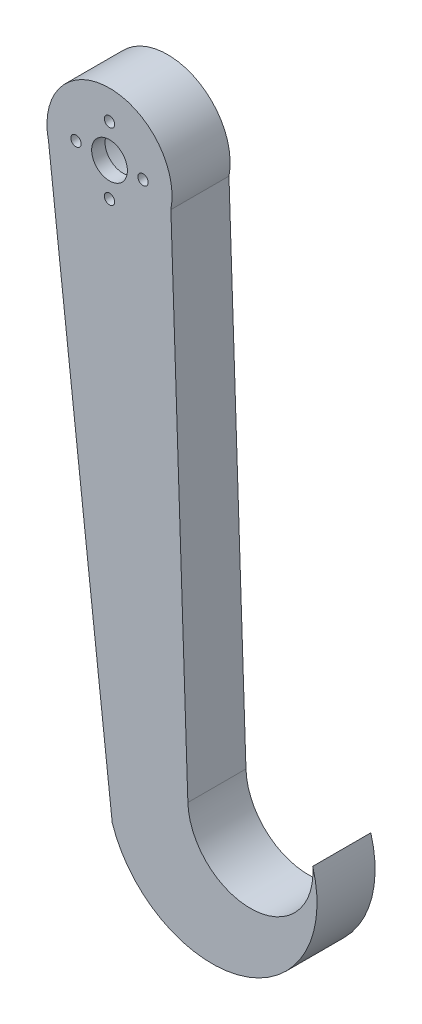
ISO-10303-21;
HEADER;
FILE_DESCRIPTION(('STEP AP214'),'2;1');
FILE_NAME('part.step','',(''),(''),'','','');
FILE_SCHEMA(('AUTOMOTIVE_DESIGN { 1 0 10303 214 1 1 1 1 }'));
ENDSEC;
DATA;
#1=APPLICATION_CONTEXT('core data for automotive mechanical design processes');
#2=APPLICATION_PROTOCOL_DEFINITION('international standard','automotive_design',2000,#1);
#3=PRODUCT_CONTEXT('',#1,'mechanical');
#4=PRODUCT('Part','Part','',(#3));
#5=PRODUCT_RELATED_PRODUCT_CATEGORY('part','',(#4));
#6=PRODUCT_DEFINITION_FORMATION('','',#4);
#7=PRODUCT_DEFINITION_CONTEXT('part definition',#1,'design');
#8=PRODUCT_DEFINITION('design','',#6,#7);
#9=PRODUCT_DEFINITION_SHAPE('','',#8);
#10=(LENGTH_UNIT() NAMED_UNIT(*) SI_UNIT(.MILLI.,.METRE.));
#11=(NAMED_UNIT(*) PLANE_ANGLE_UNIT() SI_UNIT($,.RADIAN.));
#12=(NAMED_UNIT(*) SI_UNIT($,.STERADIAN.) SOLID_ANGLE_UNIT());
#13=UNCERTAINTY_MEASURE_WITH_UNIT(LENGTH_MEASURE(1.E-05),#10,'distance_accuracy_value','');
#14=(GEOMETRIC_REPRESENTATION_CONTEXT(3) GLOBAL_UNCERTAINTY_ASSIGNED_CONTEXT((#13)) GLOBAL_UNIT_ASSIGNED_CONTEXT((#10,
#11,#12)) REPRESENTATION_CONTEXT('',''));
#15=CARTESIAN_POINT('',(0.,0.,0.));
#16=DIRECTION('',(0.,0.,1.));
#17=DIRECTION('',(1.,0.,0.));
#18=AXIS2_PLACEMENT_3D('',#15,#16,#17);
#19=CARTESIAN_POINT('',(0.,0.,13.));
#20=DIRECTION('',(0.,0.,-1.));
#21=DIRECTION('',(-1.,0.,0.));
#22=AXIS2_PLACEMENT_3D('',#19,#20,#21);
#23=CYLINDRICAL_SURFACE('',#22,14.);
#24=CARTESIAN_POINT('',(0.,0.,13.));
#25=DIRECTION('',(0.,0.,1.));
#26=DIRECTION('',(1.,0.,0.));
#27=AXIS2_PLACEMENT_3D('',#24,#25,#26);
#28=CIRCLE('',#27,14.);
#29=CARTESIAN_POINT('',(13.7355783574531,-2.70811506148946,13.));
#30=VERTEX_POINT('',#29);
#31=CARTESIAN_POINT('',(-13.6489972699894,-3.1152645993273,13.));
#32=VERTEX_POINT('',#31);
#33=EDGE_CURVE('E11',#30,#32,#28,.T.);
#34=ORIENTED_EDGE('',*,*,#33,.F.);
#35=DIRECTION('',(0.,0.,1.));
#36=VECTOR('',#35,1.);
#37=CARTESIAN_POINT('',(13.7355783574531,-2.70811506148946,0.));
#38=LINE('',#37,#36);
#39=CARTESIAN_POINT('',(13.7355783574531,-2.70811506148946,0.));
#40=VERTEX_POINT('',#39);
#41=EDGE_CURVE('E118',#40,#30,#38,.T.);
#42=ORIENTED_EDGE('',*,*,#41,.F.);
#43=CARTESIAN_POINT('',(0.,0.,0.));
#44=DIRECTION('',(0.,0.,1.));
#45=DIRECTION('',(1.,0.,0.));
#46=AXIS2_PLACEMENT_3D('',#43,#44,#45);
#47=CIRCLE('',#46,14.);
#48=CARTESIAN_POINT('',(-13.6489972699894,-3.1152645993273,0.));
#49=VERTEX_POINT('',#48);
#50=EDGE_CURVE('E41',#40,#49,#47,.T.);
#51=ORIENTED_EDGE('',*,*,#50,.T.);
#52=DIRECTION('',(0.,0.,1.));
#53=VECTOR('',#52,1.);
#54=CARTESIAN_POINT('',(-13.6489972699894,-3.11526459932734,0.));
#55=LINE('',#54,#53);
#56=EDGE_CURVE('E52',#49,#32,#55,.T.);
#57=ORIENTED_EDGE('',*,*,#56,.T.);
#58=EDGE_LOOP('',(#34,#42,#51,#57));
#59=FACE_BOUND('',#58,.T.);
#60=ADVANCED_FACE('F33',(#59),#23,.T.);
#61=CARTESIAN_POINT('',(0.,0.,13.));
#62=DIRECTION('',(0.,0.,1.));
#63=DIRECTION('',(1.,0.,0.));
#64=AXIS2_PLACEMENT_3D('',#61,#62,#63);
#65=PLANE('',#64);
#66=CARTESIAN_POINT('',(0.,7.5,13.));
#67=DIRECTION('',(0.,0.,1.));
#68=DIRECTION('',(1.,0.,0.));
#69=AXIS2_PLACEMENT_3D('',#66,#67,#68);
#70=CIRCLE('',#69,1.15);
#71=CARTESIAN_POINT('',(1.14999999999992,7.5,13.));
#72=VERTEX_POINT('',#71);
#73=EDGE_CURVE('E190',#72,#72,#70,.T.);
#74=ORIENTED_EDGE('',*,*,#73,.F.);
#75=EDGE_LOOP('',(#74));
#76=FACE_BOUND('',#75,.T.);
#77=CARTESIAN_POINT('',(7.5,0.,13.));
#78=DIRECTION('',(0.,0.,1.));
#79=DIRECTION('',(1.,0.,0.));
#80=AXIS2_PLACEMENT_3D('',#77,#78,#79);
#81=CIRCLE('',#80,1.15);
#82=CARTESIAN_POINT('',(8.65,0.,13.));
#83=VERTEX_POINT('',#82);
#84=EDGE_CURVE('E200',#83,#83,#81,.T.);
#85=ORIENTED_EDGE('',*,*,#84,.F.);
#86=EDGE_LOOP('',(#85));
#87=FACE_BOUND('',#86,.T.);
#88=CARTESIAN_POINT('',(0.,-7.5,13.));
#89=DIRECTION('',(0.,0.,1.));
#90=DIRECTION('',(1.,0.,0.));
#91=AXIS2_PLACEMENT_3D('',#88,#89,#90);
#92=CIRCLE('',#91,1.15);
#93=CARTESIAN_POINT('',(1.15000000000002,-7.5,13.));
#94=VERTEX_POINT('',#93);
#95=EDGE_CURVE('E206',#94,#94,#92,.T.);
#96=ORIENTED_EDGE('',*,*,#95,.F.);
#97=EDGE_LOOP('',(#96));
#98=FACE_BOUND('',#97,.T.);
#99=CARTESIAN_POINT('',(-7.5,0.,13.));
#100=DIRECTION('',(0.,0.,1.));
#101=DIRECTION('',(1.,0.,0.));
#102=AXIS2_PLACEMENT_3D('',#99,#100,#101);
#103=CIRCLE('',#102,1.15);
#104=CARTESIAN_POINT('',(-6.35,0.,13.));
#105=VERTEX_POINT('',#104);
#106=EDGE_CURVE('E106',#105,#105,#103,.T.);
#107=ORIENTED_EDGE('',*,*,#106,.F.);
#108=EDGE_LOOP('',(#107));
#109=FACE_BOUND('',#108,.T.);
#110=CARTESIAN_POINT('',(0.,0.,13.));
#111=DIRECTION('',(0.,0.,1.));
#112=DIRECTION('',(1.,0.,0.));
#113=AXIS2_PLACEMENT_3D('',#110,#111,#112);
#114=CIRCLE('',#113,4.);
#115=CARTESIAN_POINT('',(4.,0.,13.));
#116=VERTEX_POINT('',#115);
#117=EDGE_CURVE('E120',#116,#116,#114,.T.);
#118=ORIENTED_EDGE('',*,*,#117,.F.);
#119=EDGE_LOOP('',(#118));
#120=FACE_BOUND('',#119,.T.);
#121=ORIENTED_EDGE('',*,*,#33,.T.);
#122=DIRECTION('',(0.113325812197235,-0.99355787968786,0.));
#123=VECTOR('',#122,1.);
#124=CARTESIAN_POINT('',(-13.6489972699894,-3.11526459932734,13.));
#125=LINE('',#124,#123);
#126=CARTESIAN_POINT('',(0.60857827166369,-128.115264599327,13.));
#127=VERTEX_POINT('',#126);
#128=EDGE_CURVE('E113',#32,#127,#125,.T.);
#129=ORIENTED_EDGE('',*,*,#128,.T.);
#130=CARTESIAN_POINT('',(22.93337957418,-120.746013425787,13.));
#131=DIRECTION('',(0.,0.,1.));
#132=DIRECTION('',(1.,0.,0.));
#133=AXIS2_PLACEMENT_3D('',#130,#131,#132);
#134=CIRCLE('',#133,23.5096281564714);
#135=CARTESIAN_POINT('',(45.4860333922168,-114.106704589821,13.));
#136=VERTEX_POINT('',#135);
#137=EDGE_CURVE('E83',#127,#136,#134,.T.);
#138=ORIENTED_EDGE('',*,*,#137,.T.);
#139=CARTESIAN_POINT('',(31.5317417841716,-115.237078739225,13.));
#140=DIRECTION('',(0.,0.,-1.));
#141=DIRECTION('',(1.,0.,0.));
#142=AXIS2_PLACEMENT_3D('',#139,#140,#141);
#143=CIRCLE('',#142,14.);
#144=CARTESIAN_POINT('',(17.5396681428879,-115.708115061489,13.));
#145=VERTEX_POINT('',#144);
#146=EDGE_CURVE('E103',#136,#145,#143,.T.);
#147=ORIENTED_EDGE('',*,*,#146,.T.);
#148=DIRECTION('',(-0.0336454515903026,0.999433831520269,0.));
#149=VECTOR('',#148,1.);
#150=CARTESIAN_POINT('',(13.7355783574531,-2.70811506148946,13.));
#151=LINE('',#150,#149);
#152=EDGE_CURVE('E100',#145,#30,#151,.T.);
#153=ORIENTED_EDGE('',*,*,#152,.T.);
#154=EDGE_LOOP('',(#121,#129,#138,#147,#153));
#155=FACE_BOUND('',#154,.T.);
#156=ADVANCED_FACE('F139',(#76,#87,#98,#109,#120,#155),#65,.T.);
#157=CARTESIAN_POINT('',(0.,0.,0.));
#158=DIRECTION('',(0.,0.,1.));
#159=DIRECTION('',(1.,0.,0.));
#160=AXIS2_PLACEMENT_3D('',#157,#158,#159);
#161=PLANE('',#160);
#162=CARTESIAN_POINT('',(0.,0.,0.));
#163=DIRECTION('',(0.,0.,-1.));
#164=DIRECTION('',(-1.,0.,0.));
#165=AXIS2_PLACEMENT_3D('',#162,#163,#164);
#166=CIRCLE('',#165,10.6);
#167=CARTESIAN_POINT('',(-10.6,0.,0.));
#168=VERTEX_POINT('',#167);
#169=EDGE_CURVE('E130',#168,#168,#166,.T.);
#170=ORIENTED_EDGE('',*,*,#169,.F.);
#171=EDGE_LOOP('',(#170));
#172=FACE_BOUND('',#171,.T.);
#173=ORIENTED_EDGE('',*,*,#50,.F.);
#174=DIRECTION('',(-0.0336454515903026,0.999433831520269,0.));
#175=VECTOR('',#174,1.);
#176=CARTESIAN_POINT('',(13.7355783574531,-2.70811506148946,0.));
#177=LINE('',#176,#175);
#178=CARTESIAN_POINT('',(17.5396681428879,-115.708115061489,0.));
#179=VERTEX_POINT('',#178);
#180=EDGE_CURVE('E110',#179,#40,#177,.T.);
#181=ORIENTED_EDGE('',*,*,#180,.F.);
#182=CARTESIAN_POINT('',(31.5317417841716,-115.237078739225,0.));
#183=DIRECTION('',(0.,0.,-1.));
#184=DIRECTION('',(1.,0.,0.));
#185=AXIS2_PLACEMENT_3D('',#182,#183,#184);
#186=CIRCLE('',#185,14.);
#187=CARTESIAN_POINT('',(45.4860333922168,-114.106704589821,0.));
#188=VERTEX_POINT('',#187);
#189=EDGE_CURVE('E97',#188,#179,#186,.T.);
#190=ORIENTED_EDGE('',*,*,#189,.F.);
#191=CARTESIAN_POINT('',(22.93337957418,-120.746013425787,0.));
#192=DIRECTION('',(0.,0.,1.));
#193=DIRECTION('',(1.,0.,0.));
#194=AXIS2_PLACEMENT_3D('',#191,#192,#193);
#195=CIRCLE('',#194,23.5096281564714);
#196=CARTESIAN_POINT('',(0.60857827166369,-128.115264599327,0.));
#197=VERTEX_POINT('',#196);
#198=EDGE_CURVE('E81',#197,#188,#195,.T.);
#199=ORIENTED_EDGE('',*,*,#198,.F.);
#200=DIRECTION('',(0.113325812197235,-0.99355787968786,0.));
#201=VECTOR('',#200,1.);
#202=CARTESIAN_POINT('',(-13.6489972699894,-3.11526459932734,0.));
#203=LINE('',#202,#201);
#204=EDGE_CURVE('E94',#49,#197,#203,.T.);
#205=ORIENTED_EDGE('',*,*,#204,.F.);
#206=EDGE_LOOP('',(#173,#181,#190,#199,#205));
#207=FACE_BOUND('',#206,.T.);
#208=ADVANCED_FACE('F93',(#172,#207),#161,.F.);
#209=CARTESIAN_POINT('',(0.,0.,10.));
#210=DIRECTION('',(0.,0.,-1.));
#211=DIRECTION('',(-1.,0.,0.));
#212=AXIS2_PLACEMENT_3D('',#209,#210,#211);
#213=CYLINDRICAL_SURFACE('',#212,10.6);
#214=CARTESIAN_POINT('',(0.,0.,10.));
#215=DIRECTION('',(0.,0.,-1.));
#216=DIRECTION('',(-1.,0.,0.));
#217=AXIS2_PLACEMENT_3D('',#214,#215,#216);
#218=CIRCLE('',#217,10.6);
#219=CARTESIAN_POINT('',(-10.6,0.,10.));
#220=VERTEX_POINT('',#219);
#221=EDGE_CURVE('E127',#220,#220,#218,.T.);
#222=ORIENTED_EDGE('',*,*,#221,.F.);
#223=EDGE_LOOP('',(#222));
#224=FACE_BOUND('',#223,.T.);
#225=ORIENTED_EDGE('',*,*,#169,.T.);
#226=EDGE_LOOP('',(#225));
#227=FACE_BOUND('',#226,.T.);
#228=ADVANCED_FACE('F147',(#224,#227),#213,.F.);
#229=CARTESIAN_POINT('',(0.,0.,10.));
#230=DIRECTION('',(0.,0.,-1.));
#231=DIRECTION('',(-1.,0.,0.));
#232=AXIS2_PLACEMENT_3D('',#229,#230,#231);
#233=PLANE('',#232);
#234=CARTESIAN_POINT('',(0.,7.5,10.));
#235=DIRECTION('',(0.,0.,-1.));
#236=DIRECTION('',(-1.,0.,0.));
#237=AXIS2_PLACEMENT_3D('',#234,#235,#236);
#238=CIRCLE('',#237,1.15);
#239=CARTESIAN_POINT('',(-1.15000000000008,7.5,10.));
#240=VERTEX_POINT('',#239);
#241=EDGE_CURVE('E193',#240,#240,#238,.T.);
#242=ORIENTED_EDGE('',*,*,#241,.F.);
#243=EDGE_LOOP('',(#242));
#244=FACE_BOUND('',#243,.T.);
#245=CARTESIAN_POINT('',(7.5,0.,10.));
#246=DIRECTION('',(0.,0.,-1.));
#247=DIRECTION('',(-1.,0.,0.));
#248=AXIS2_PLACEMENT_3D('',#245,#246,#247);
#249=CIRCLE('',#248,1.15);
#250=CARTESIAN_POINT('',(6.35,0.,10.));
#251=VERTEX_POINT('',#250);
#252=EDGE_CURVE('E195',#251,#251,#249,.T.);
#253=ORIENTED_EDGE('',*,*,#252,.F.);
#254=EDGE_LOOP('',(#253));
#255=FACE_BOUND('',#254,.T.);
#256=CARTESIAN_POINT('',(0.,-7.5,10.));
#257=DIRECTION('',(0.,0.,-1.));
#258=DIRECTION('',(-1.,0.,0.));
#259=AXIS2_PLACEMENT_3D('',#256,#257,#258);
#260=CIRCLE('',#259,1.15);
#261=CARTESIAN_POINT('',(-1.14999999999997,-7.5,10.));
#262=VERTEX_POINT('',#261);
#263=EDGE_CURVE('E203',#262,#262,#260,.T.);
#264=ORIENTED_EDGE('',*,*,#263,.F.);
#265=EDGE_LOOP('',(#264));
#266=FACE_BOUND('',#265,.T.);
#267=CARTESIAN_POINT('',(-7.5,0.,10.));
#268=DIRECTION('',(0.,0.,-1.));
#269=DIRECTION('',(-1.,0.,0.));
#270=AXIS2_PLACEMENT_3D('',#267,#268,#269);
#271=CIRCLE('',#270,1.15);
#272=CARTESIAN_POINT('',(-8.65,0.,10.));
#273=VERTEX_POINT('',#272);
#274=EDGE_CURVE('E208',#273,#273,#271,.T.);
#275=ORIENTED_EDGE('',*,*,#274,.F.);
#276=EDGE_LOOP('',(#275));
#277=FACE_BOUND('',#276,.T.);
#278=CARTESIAN_POINT('',(0.,0.,10.));
#279=DIRECTION('',(0.,0.,-1.));
#280=DIRECTION('',(-1.,0.,0.));
#281=AXIS2_PLACEMENT_3D('',#278,#279,#280);
#282=CIRCLE('',#281,4.);
#283=CARTESIAN_POINT('',(-4.,0.,10.));
#284=VERTEX_POINT('',#283);
#285=EDGE_CURVE('E36',#284,#284,#282,.T.);
#286=ORIENTED_EDGE('',*,*,#285,.F.);
#287=EDGE_LOOP('',(#286));
#288=FACE_BOUND('',#287,.T.);
#289=ORIENTED_EDGE('',*,*,#221,.T.);
#290=EDGE_LOOP('',(#289));
#291=FACE_BOUND('',#290,.T.);
#292=ADVANCED_FACE('F154',(#244,#255,#266,#277,#288,#291),#233,.T.);
#293=CARTESIAN_POINT('',(0.,0.,3.));
#294=DIRECTION('',(0.,0.,1.));
#295=DIRECTION('',(1.,0.,0.));
#296=AXIS2_PLACEMENT_3D('',#293,#294,#295);
#297=CYLINDRICAL_SURFACE('',#296,4.);
#298=ORIENTED_EDGE('',*,*,#285,.T.);
#299=EDGE_LOOP('',(#298));
#300=FACE_BOUND('',#299,.T.);
#301=ORIENTED_EDGE('',*,*,#117,.T.);
#302=EDGE_LOOP('',(#301));
#303=FACE_BOUND('',#302,.T.);
#304=ADVANCED_FACE('F158',(#300,#303),#297,.F.);
#305=CARTESIAN_POINT('',(13.7355783574531,-2.70811506148946,0.));
#306=DIRECTION('',(0.999433831520269,0.0336454515903026,0.));
#307=DIRECTION('',(-0.0336454515903026,0.999433831520269,0.));
#308=AXIS2_PLACEMENT_3D('',#305,#306,#307);
#309=PLANE('',#308);
#310=ORIENTED_EDGE('',*,*,#152,.F.);
#311=DIRECTION('',(0.,0.,1.));
#312=VECTOR('',#311,1.);
#313=CARTESIAN_POINT('',(17.5396681428879,-115.708115061489,0.));
#314=LINE('',#313,#312);
#315=EDGE_CURVE('E121',#179,#145,#314,.T.);
#316=ORIENTED_EDGE('',*,*,#315,.F.);
#317=ORIENTED_EDGE('',*,*,#180,.T.);
#318=ORIENTED_EDGE('',*,*,#41,.T.);
#319=EDGE_LOOP('',(#310,#316,#317,#318));
#320=FACE_BOUND('',#319,.T.);
#321=ADVANCED_FACE('F134',(#320),#309,.T.);
#322=CARTESIAN_POINT('',(31.5317417841716,-115.237078739225,0.));
#323=DIRECTION('',(0.,0.,1.));
#324=DIRECTION('',(1.,0.,0.));
#325=AXIS2_PLACEMENT_3D('',#322,#323,#324);
#326=CYLINDRICAL_SURFACE('',#325,14.);
#327=ORIENTED_EDGE('',*,*,#146,.F.);
#328=DIRECTION('',(0.,0.,1.));
#329=VECTOR('',#328,1.);
#330=CARTESIAN_POINT('',(45.4860333922168,-114.106704589821,0.));
#331=LINE('',#330,#329);
#332=EDGE_CURVE('E88',#188,#136,#331,.T.);
#333=ORIENTED_EDGE('',*,*,#332,.F.);
#334=ORIENTED_EDGE('',*,*,#189,.T.);
#335=ORIENTED_EDGE('',*,*,#315,.T.);
#336=EDGE_LOOP('',(#327,#333,#334,#335));
#337=FACE_BOUND('',#336,.T.);
#338=ADVANCED_FACE('F137',(#337),#326,.F.);
#339=CARTESIAN_POINT('',(22.93337957418,-120.746013425787,0.));
#340=DIRECTION('',(0.,0.,1.));
#341=DIRECTION('',(1.,0.,0.));
#342=AXIS2_PLACEMENT_3D('',#339,#340,#341);
#343=CYLINDRICAL_SURFACE('',#342,23.5096281564714);
#344=ORIENTED_EDGE('',*,*,#137,.F.);
#345=DIRECTION('',(0.,0.,1.));
#346=VECTOR('',#345,1.);
#347=CARTESIAN_POINT('',(0.60857827166369,-128.115264599327,0.));
#348=LINE('',#347,#346);
#349=EDGE_CURVE('E78',#197,#127,#348,.T.);
#350=ORIENTED_EDGE('',*,*,#349,.F.);
#351=ORIENTED_EDGE('',*,*,#198,.T.);
#352=ORIENTED_EDGE('',*,*,#332,.T.);
#353=EDGE_LOOP('',(#344,#350,#351,#352));
#354=FACE_BOUND('',#353,.T.);
#355=ADVANCED_FACE('F80',(#354),#343,.T.);
#356=CARTESIAN_POINT('',(-13.6489972699894,-3.11526459932734,0.));
#357=DIRECTION('',(-0.99355787968786,-0.113325812197235,0.));
#358=DIRECTION('',(0.113325812197235,-0.993557879687861,0.));
#359=AXIS2_PLACEMENT_3D('',#356,#357,#358);
#360=PLANE('',#359);
#361=ORIENTED_EDGE('',*,*,#128,.F.);
#362=ORIENTED_EDGE('',*,*,#56,.F.);
#363=ORIENTED_EDGE('',*,*,#204,.T.);
#364=ORIENTED_EDGE('',*,*,#349,.T.);
#365=EDGE_LOOP('',(#361,#362,#363,#364));
#366=FACE_BOUND('',#365,.T.);
#367=ADVANCED_FACE('F99',(#366),#360,.T.);
#368=CARTESIAN_POINT('',(-7.5,0.,24.));
#369=DIRECTION('',(0.,0.,-1.));
#370=DIRECTION('',(-1.,0.,0.));
#371=AXIS2_PLACEMENT_3D('',#368,#369,#370);
#372=CYLINDRICAL_SURFACE('',#371,1.15);
#373=ORIENTED_EDGE('',*,*,#106,.T.);
#374=EDGE_LOOP('',(#373));
#375=FACE_BOUND('',#374,.T.);
#376=ORIENTED_EDGE('',*,*,#274,.T.);
#377=EDGE_LOOP('',(#376));
#378=FACE_BOUND('',#377,.T.);
#379=ADVANCED_FACE('F165',(#375,#378),#372,.F.);
#380=CARTESIAN_POINT('',(0.,-7.5,24.));
#381=DIRECTION('',(0.,0.,-1.));
#382=DIRECTION('',(-1.,0.,0.));
#383=AXIS2_PLACEMENT_3D('',#380,#381,#382);
#384=CYLINDRICAL_SURFACE('',#383,1.15);
#385=ORIENTED_EDGE('',*,*,#95,.T.);
#386=EDGE_LOOP('',(#385));
#387=FACE_BOUND('',#386,.T.);
#388=ORIENTED_EDGE('',*,*,#263,.T.);
#389=EDGE_LOOP('',(#388));
#390=FACE_BOUND('',#389,.T.);
#391=ADVANCED_FACE('F174',(#387,#390),#384,.F.);
#392=CARTESIAN_POINT('',(7.5,0.,24.));
#393=DIRECTION('',(0.,0.,-1.));
#394=DIRECTION('',(-1.,0.,0.));
#395=AXIS2_PLACEMENT_3D('',#392,#393,#394);
#396=CYLINDRICAL_SURFACE('',#395,1.15);
#397=ORIENTED_EDGE('',*,*,#84,.T.);
#398=EDGE_LOOP('',(#397));
#399=FACE_BOUND('',#398,.T.);
#400=ORIENTED_EDGE('',*,*,#252,.T.);
#401=EDGE_LOOP('',(#400));
#402=FACE_BOUND('',#401,.T.);
#403=ADVANCED_FACE('F178',(#399,#402),#396,.F.);
#404=CARTESIAN_POINT('',(0.,7.5,24.));
#405=DIRECTION('',(0.,0.,-1.));
#406=DIRECTION('',(-1.,0.,0.));
#407=AXIS2_PLACEMENT_3D('',#404,#405,#406);
#408=CYLINDRICAL_SURFACE('',#407,1.15);
#409=ORIENTED_EDGE('',*,*,#73,.T.);
#410=EDGE_LOOP('',(#409));
#411=FACE_BOUND('',#410,.T.);
#412=ORIENTED_EDGE('',*,*,#241,.T.);
#413=EDGE_LOOP('',(#412));
#414=FACE_BOUND('',#413,.T.);
#415=ADVANCED_FACE('F182',(#411,#414),#408,.F.);
#416=CLOSED_SHELL('',(#60,#156,#208,#228,#292,#304,#321,#338,#355,#367,#379,#391,#403,#415));
#417=MANIFOLD_SOLID_BREP('B2',#416);
#418=ADVANCED_BREP_SHAPE_REPRESENTATION('',(#18,#417),#14);
#419=SHAPE_DEFINITION_REPRESENTATION(#9,#418);
ENDSEC;
END-ISO-10303-21;
